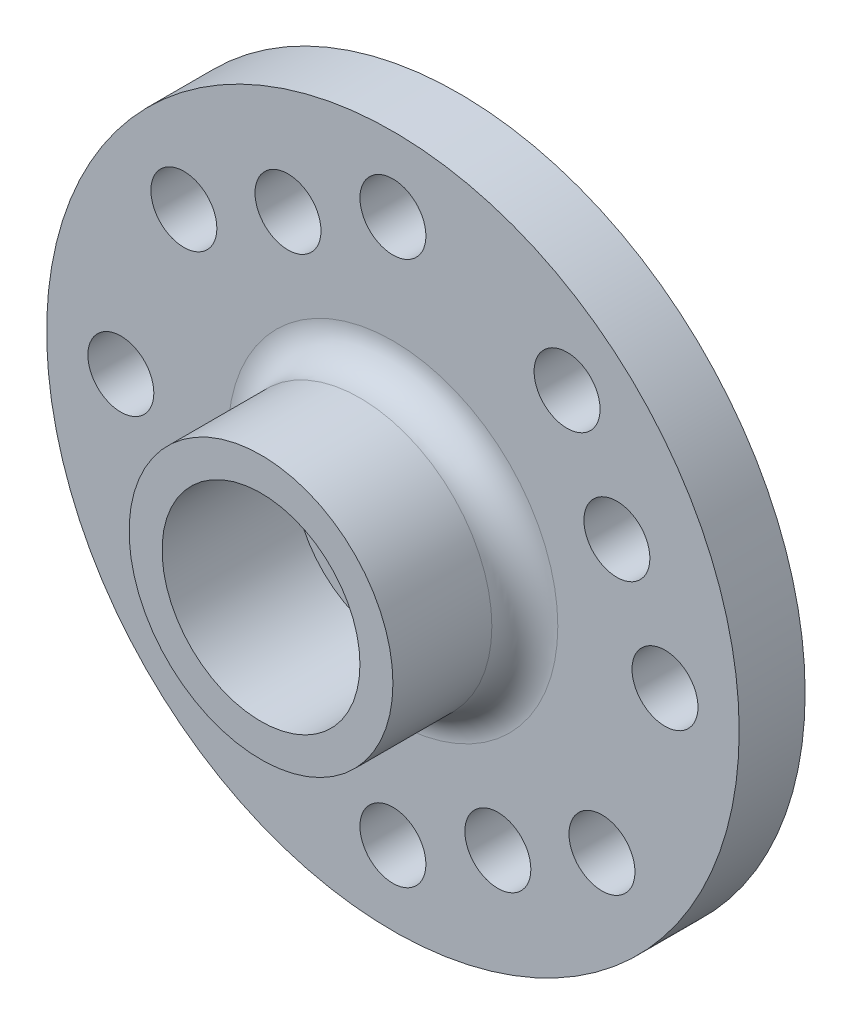
ISO-10303-21;
HEADER;
FILE_DESCRIPTION(('STEP AP214'),'2;1');
FILE_NAME('part.step','',(''),(''),'','','');
FILE_SCHEMA(('AUTOMOTIVE_DESIGN { 1 0 10303 214 1 1 1 1 }'));
ENDSEC;
DATA;
#1=APPLICATION_CONTEXT('core data for automotive mechanical design processes');
#2=APPLICATION_PROTOCOL_DEFINITION('international standard','automotive_design',2000,#1);
#3=PRODUCT_CONTEXT('',#1,'mechanical');
#4=PRODUCT('Part','Part','',(#3));
#5=PRODUCT_RELATED_PRODUCT_CATEGORY('part','',(#4));
#6=PRODUCT_DEFINITION_FORMATION('','',#4);
#7=PRODUCT_DEFINITION_CONTEXT('part definition',#1,'design');
#8=PRODUCT_DEFINITION('design','',#6,#7);
#9=PRODUCT_DEFINITION_SHAPE('','',#8);
#10=(LENGTH_UNIT() NAMED_UNIT(*) SI_UNIT(.MILLI.,.METRE.));
#11=(NAMED_UNIT(*) PLANE_ANGLE_UNIT() SI_UNIT($,.RADIAN.));
#12=(NAMED_UNIT(*) SI_UNIT($,.STERADIAN.) SOLID_ANGLE_UNIT());
#13=UNCERTAINTY_MEASURE_WITH_UNIT(LENGTH_MEASURE(1.E-05),#10,'distance_accuracy_value','');
#14=(GEOMETRIC_REPRESENTATION_CONTEXT(3) GLOBAL_UNCERTAINTY_ASSIGNED_CONTEXT((#13)) GLOBAL_UNIT_ASSIGNED_CONTEXT((#10,
#11,#12)) REPRESENTATION_CONTEXT('',''));
#15=CARTESIAN_POINT('',(0.,0.,0.));
#16=DIRECTION('',(0.,0.,1.));
#17=DIRECTION('',(1.,0.,0.));
#18=AXIS2_PLACEMENT_3D('',#15,#16,#17);
#19=CARTESIAN_POINT('',(0.,0.,0.));
#20=DIRECTION('',(0.,0.,1.));
#21=DIRECTION('',(1.,0.,0.));
#22=AXIS2_PLACEMENT_3D('',#19,#20,#21);
#23=CYLINDRICAL_SURFACE('',#22,1.5);
#24=CARTESIAN_POINT('',(0.,0.,2.));
#25=DIRECTION('',(0.,0.,1.));
#26=DIRECTION('',(1.,0.,0.));
#27=AXIS2_PLACEMENT_3D('',#24,#25,#26);
#28=CIRCLE('',#27,1.5);
#29=CARTESIAN_POINT('',(1.5,0.,2.));
#30=VERTEX_POINT('',#29);
#31=EDGE_CURVE('E133',#30,#30,#28,.T.);
#32=ORIENTED_EDGE('',*,*,#31,.T.);
#33=EDGE_LOOP('',(#32));
#34=FACE_BOUND('',#33,.T.);
#35=CARTESIAN_POINT('',(0.,0.,1.));
#36=DIRECTION('',(0.,0.,-1.));
#37=DIRECTION('',(-1.,0.,0.));
#38=AXIS2_PLACEMENT_3D('',#35,#36,#37);
#39=CIRCLE('',#38,1.5);
#40=CARTESIAN_POINT('',(-1.5,0.,1.));
#41=VERTEX_POINT('',#40);
#42=EDGE_CURVE('E49',#41,#41,#39,.F.);
#43=ORIENTED_EDGE('',*,*,#42,.F.);
#44=EDGE_LOOP('',(#43));
#45=FACE_BOUND('',#44,.T.);
#46=ADVANCED_FACE('F32',(#34,#45),#23,.F.);
#47=CARTESIAN_POINT('',(0.,0.,0.));
#48=DIRECTION('',(0.,0.,1.));
#49=DIRECTION('',(1.,0.,0.));
#50=AXIS2_PLACEMENT_3D('',#47,#48,#49);
#51=PLANE('',#50);
#52=CARTESIAN_POINT('',(3.18181818181818,-6.79161490794724,0.));
#53=DIRECTION('',(0.,0.,-1.));
#54=DIRECTION('',(-1.,0.,0.));
#55=AXIS2_PLACEMENT_3D('',#52,#53,#54);
#56=CIRCLE('',#55,1.);
#57=CARTESIAN_POINT('',(2.18181818181818,-6.79161490794724,0.));
#58=VERTEX_POINT('',#57);
#59=EDGE_CURVE('E106',#58,#58,#56,.T.);
#60=ORIENTED_EDGE('',*,*,#59,.F.);
#61=EDGE_LOOP('',(#60));
#62=FACE_BOUND('',#61,.T.);
#63=CARTESIAN_POINT('',(6.33884058075076,-5.28030303030303,0.));
#64=DIRECTION('',(0.,0.,-1.));
#65=DIRECTION('',(-1.,0.,0.));
#66=AXIS2_PLACEMENT_3D('',#63,#64,#65);
#67=CIRCLE('',#66,0.999999999999999);
#68=CARTESIAN_POINT('',(5.33884058075076,-5.28030303030303,0.));
#69=VERTEX_POINT('',#68);
#70=EDGE_CURVE('E96',#69,#69,#67,.T.);
#71=ORIENTED_EDGE('',*,*,#70,.F.);
#72=EDGE_LOOP('',(#71));
#73=FACE_BOUND('',#72,.T.);
#74=CARTESIAN_POINT('',(6.79161490794724,3.18181818181818,0.));
#75=DIRECTION('',(0.,0.,-1.));
#76=DIRECTION('',(-1.,0.,0.));
#77=AXIS2_PLACEMENT_3D('',#74,#75,#76);
#78=CIRCLE('',#77,0.999999999999999);
#79=CARTESIAN_POINT('',(5.79161490794724,3.18181818181818,0.));
#80=VERTEX_POINT('',#79);
#81=EDGE_CURVE('E93',#80,#80,#78,.T.);
#82=ORIENTED_EDGE('',*,*,#81,.F.);
#83=EDGE_LOOP('',(#82));
#84=FACE_BOUND('',#83,.T.);
#85=CARTESIAN_POINT('',(5.28030303030303,6.33884058075076,0.));
#86=DIRECTION('',(0.,0.,-1.));
#87=DIRECTION('',(-1.,0.,0.));
#88=AXIS2_PLACEMENT_3D('',#85,#86,#87);
#89=CIRCLE('',#88,1.);
#90=CARTESIAN_POINT('',(4.28030303030303,6.33884058075076,0.));
#91=VERTEX_POINT('',#90);
#92=EDGE_CURVE('E90',#91,#91,#89,.T.);
#93=ORIENTED_EDGE('',*,*,#92,.F.);
#94=EDGE_LOOP('',(#93));
#95=FACE_BOUND('',#94,.T.);
#96=CARTESIAN_POINT('',(-3.18181818181818,6.79161490794724,0.));
#97=DIRECTION('',(0.,0.,-1.));
#98=DIRECTION('',(-1.,0.,0.));
#99=AXIS2_PLACEMENT_3D('',#96,#97,#98);
#100=CIRCLE('',#99,1.);
#101=CARTESIAN_POINT('',(-4.18181818181818,6.79161490794724,0.));
#102=VERTEX_POINT('',#101);
#103=EDGE_CURVE('E86',#102,#102,#100,.T.);
#104=ORIENTED_EDGE('',*,*,#103,.F.);
#105=EDGE_LOOP('',(#104));
#106=FACE_BOUND('',#105,.T.);
#107=CARTESIAN_POINT('',(-6.33884058075076,5.28030303030303,0.));
#108=DIRECTION('',(0.,0.,-1.));
#109=DIRECTION('',(-1.,0.,0.));
#110=AXIS2_PLACEMENT_3D('',#107,#108,#109);
#111=CIRCLE('',#110,1.);
#112=CARTESIAN_POINT('',(-7.33884058075076,5.28030303030303,0.));
#113=VERTEX_POINT('',#112);
#114=EDGE_CURVE('E82',#113,#113,#111,.T.);
#115=ORIENTED_EDGE('',*,*,#114,.F.);
#116=EDGE_LOOP('',(#115));
#117=FACE_BOUND('',#116,.T.);
#118=CARTESIAN_POINT('',(-8.25,0.,0.));
#119=DIRECTION('',(0.,0.,-1.));
#120=DIRECTION('',(-1.,0.,0.));
#121=AXIS2_PLACEMENT_3D('',#118,#119,#120);
#122=CIRCLE('',#121,1.);
#123=CARTESIAN_POINT('',(-9.25,0.,0.));
#124=VERTEX_POINT('',#123);
#125=EDGE_CURVE('E78',#124,#124,#122,.T.);
#126=ORIENTED_EDGE('',*,*,#125,.F.);
#127=EDGE_LOOP('',(#126));
#128=FACE_BOUND('',#127,.T.);
#129=CARTESIAN_POINT('',(-6.79161490794724,-3.18181818181818,0.));
#130=DIRECTION('',(0.,0.,-1.));
#131=DIRECTION('',(-1.,0.,0.));
#132=AXIS2_PLACEMENT_3D('',#129,#130,#131);
#133=CIRCLE('',#132,1.);
#134=CARTESIAN_POINT('',(-7.79161490794724,-3.18181818181818,0.));
#135=VERTEX_POINT('',#134);
#136=EDGE_CURVE('E74',#135,#135,#133,.T.);
#137=ORIENTED_EDGE('',*,*,#136,.F.);
#138=EDGE_LOOP('',(#137));
#139=FACE_BOUND('',#138,.T.);
#140=CARTESIAN_POINT('',(-5.28030303030303,-6.33884058075076,0.));
#141=DIRECTION('',(0.,0.,-1.));
#142=DIRECTION('',(-1.,0.,0.));
#143=AXIS2_PLACEMENT_3D('',#140,#141,#142);
#144=CIRCLE('',#143,1.);
#145=CARTESIAN_POINT('',(-6.28030303030303,-6.33884058075076,0.));
#146=VERTEX_POINT('',#145);
#147=EDGE_CURVE('E70',#146,#146,#144,.T.);
#148=ORIENTED_EDGE('',*,*,#147,.F.);
#149=EDGE_LOOP('',(#148));
#150=FACE_BOUND('',#149,.T.);
#151=CARTESIAN_POINT('',(0.,-8.25,0.));
#152=DIRECTION('',(0.,0.,-1.));
#153=DIRECTION('',(-1.,0.,0.));
#154=AXIS2_PLACEMENT_3D('',#151,#152,#153);
#155=CIRCLE('',#154,1.);
#156=CARTESIAN_POINT('',(-1.,-8.25,0.));
#157=VERTEX_POINT('',#156);
#158=EDGE_CURVE('E66',#157,#157,#155,.T.);
#159=ORIENTED_EDGE('',*,*,#158,.F.);
#160=EDGE_LOOP('',(#159));
#161=FACE_BOUND('',#160,.T.);
#162=CARTESIAN_POINT('',(8.25,0.,0.));
#163=DIRECTION('',(0.,0.,-1.));
#164=DIRECTION('',(-1.,0.,0.));
#165=AXIS2_PLACEMENT_3D('',#162,#163,#164);
#166=CIRCLE('',#165,1.);
#167=CARTESIAN_POINT('',(7.25,0.,0.));
#168=VERTEX_POINT('',#167);
#169=EDGE_CURVE('E62',#168,#168,#166,.T.);
#170=ORIENTED_EDGE('',*,*,#169,.F.);
#171=EDGE_LOOP('',(#170));
#172=FACE_BOUND('',#171,.T.);
#173=CARTESIAN_POINT('',(0.,8.25,0.));
#174=DIRECTION('',(0.,0.,-1.));
#175=DIRECTION('',(-1.,0.,0.));
#176=AXIS2_PLACEMENT_3D('',#173,#174,#175);
#177=CIRCLE('',#176,1.);
#178=CARTESIAN_POINT('',(-1.,8.25,0.));
#179=VERTEX_POINT('',#178);
#180=EDGE_CURVE('E58',#179,#179,#177,.T.);
#181=ORIENTED_EDGE('',*,*,#180,.F.);
#182=EDGE_LOOP('',(#181));
#183=FACE_BOUND('',#182,.T.);
#184=CARTESIAN_POINT('',(0.,0.,0.));
#185=DIRECTION('',(0.,0.,1.));
#186=DIRECTION('',(1.,0.,0.));
#187=AXIS2_PLACEMENT_3D('',#184,#185,#186);
#188=CIRCLE('',#187,10.5);
#189=CARTESIAN_POINT('',(10.5,0.,0.));
#190=VERTEX_POINT('',#189);
#191=EDGE_CURVE('E142',#190,#190,#188,.T.);
#192=ORIENTED_EDGE('',*,*,#191,.F.);
#193=EDGE_LOOP('',(#192));
#194=FACE_BOUND('',#193,.T.);
#195=CARTESIAN_POINT('',(0.,0.,0.));
#196=DIRECTION('',(0.,0.,1.));
#197=DIRECTION('',(1.,0.,0.));
#198=AXIS2_PLACEMENT_3D('',#195,#196,#197);
#199=CIRCLE('',#198,3.5);
#200=CARTESIAN_POINT('',(3.5,0.,0.));
#201=VERTEX_POINT('',#200);
#202=EDGE_CURVE('E10',#201,#201,#199,.F.);
#203=ORIENTED_EDGE('',*,*,#202,.F.);
#204=EDGE_LOOP('',(#203));
#205=FACE_BOUND('',#204,.T.);
#206=ADVANCED_FACE('F173',(#62,#73,#84,#95,#106,#117,#128,#139,#150,#161,#172,#183,#194,#205),
#51,.F.);
#207=CARTESIAN_POINT('',(0.,0.,2.));
#208=DIRECTION('',(0.,0.,1.));
#209=DIRECTION('',(1.,0.,0.));
#210=AXIS2_PLACEMENT_3D('',#207,#208,#209);
#211=PLANE('',#210);
#212=CARTESIAN_POINT('',(3.18181818181818,-6.79161490794724,2.));
#213=DIRECTION('',(0.,0.,1.));
#214=DIRECTION('',(1.,0.,0.));
#215=AXIS2_PLACEMENT_3D('',#212,#213,#214);
#216=CIRCLE('',#215,1.);
#217=CARTESIAN_POINT('',(4.18181818181818,-6.79161490794724,2.));
#218=VERTEX_POINT('',#217);
#219=EDGE_CURVE('E36',#218,#218,#216,.T.);
#220=ORIENTED_EDGE('',*,*,#219,.F.);
#221=EDGE_LOOP('',(#220));
#222=FACE_BOUND('',#221,.T.);
#223=CARTESIAN_POINT('',(6.33884058075076,-5.28030303030303,2.));
#224=DIRECTION('',(0.,0.,1.));
#225=DIRECTION('',(1.,0.,0.));
#226=AXIS2_PLACEMENT_3D('',#223,#224,#225);
#227=CIRCLE('',#226,0.999999999999999);
#228=CARTESIAN_POINT('',(7.33884058075076,-5.28030303030303,2.));
#229=VERTEX_POINT('',#228);
#230=EDGE_CURVE('E94',#229,#229,#227,.T.);
#231=ORIENTED_EDGE('',*,*,#230,.F.);
#232=EDGE_LOOP('',(#231));
#233=FACE_BOUND('',#232,.T.);
#234=CARTESIAN_POINT('',(6.79161490794724,3.18181818181818,2.));
#235=DIRECTION('',(0.,0.,1.));
#236=DIRECTION('',(1.,0.,0.));
#237=AXIS2_PLACEMENT_3D('',#234,#235,#236);
#238=CIRCLE('',#237,0.999999999999999);
#239=CARTESIAN_POINT('',(7.79161490794724,3.18181818181818,2.));
#240=VERTEX_POINT('',#239);
#241=EDGE_CURVE('E91',#240,#240,#238,.T.);
#242=ORIENTED_EDGE('',*,*,#241,.F.);
#243=EDGE_LOOP('',(#242));
#244=FACE_BOUND('',#243,.T.);
#245=CARTESIAN_POINT('',(5.28030303030303,6.33884058075076,2.));
#246=DIRECTION('',(0.,0.,1.));
#247=DIRECTION('',(1.,0.,0.));
#248=AXIS2_PLACEMENT_3D('',#245,#246,#247);
#249=CIRCLE('',#248,1.);
#250=CARTESIAN_POINT('',(6.28030303030303,6.33884058075076,2.));
#251=VERTEX_POINT('',#250);
#252=EDGE_CURVE('E87',#251,#251,#249,.T.);
#253=ORIENTED_EDGE('',*,*,#252,.F.);
#254=EDGE_LOOP('',(#253));
#255=FACE_BOUND('',#254,.T.);
#256=CARTESIAN_POINT('',(-3.18181818181818,6.79161490794724,2.));
#257=DIRECTION('',(0.,0.,1.));
#258=DIRECTION('',(1.,0.,0.));
#259=AXIS2_PLACEMENT_3D('',#256,#257,#258);
#260=CIRCLE('',#259,1.);
#261=CARTESIAN_POINT('',(-2.18181818181818,6.79161490794724,2.));
#262=VERTEX_POINT('',#261);
#263=EDGE_CURVE('E83',#262,#262,#260,.T.);
#264=ORIENTED_EDGE('',*,*,#263,.F.);
#265=EDGE_LOOP('',(#264));
#266=FACE_BOUND('',#265,.T.);
#267=CARTESIAN_POINT('',(-6.33884058075076,5.28030303030303,2.));
#268=DIRECTION('',(0.,0.,1.));
#269=DIRECTION('',(1.,0.,0.));
#270=AXIS2_PLACEMENT_3D('',#267,#268,#269);
#271=CIRCLE('',#270,1.);
#272=CARTESIAN_POINT('',(-5.33884058075076,5.28030303030303,2.));
#273=VERTEX_POINT('',#272);
#274=EDGE_CURVE('E79',#273,#273,#271,.T.);
#275=ORIENTED_EDGE('',*,*,#274,.F.);
#276=EDGE_LOOP('',(#275));
#277=FACE_BOUND('',#276,.T.);
#278=CARTESIAN_POINT('',(-8.25,0.,2.));
#279=DIRECTION('',(0.,0.,1.));
#280=DIRECTION('',(1.,0.,0.));
#281=AXIS2_PLACEMENT_3D('',#278,#279,#280);
#282=CIRCLE('',#281,1.);
#283=CARTESIAN_POINT('',(-7.25,0.,2.));
#284=VERTEX_POINT('',#283);
#285=EDGE_CURVE('E75',#284,#284,#282,.T.);
#286=ORIENTED_EDGE('',*,*,#285,.F.);
#287=EDGE_LOOP('',(#286));
#288=FACE_BOUND('',#287,.T.);
#289=CARTESIAN_POINT('',(-6.79161490794724,-3.18181818181818,2.));
#290=DIRECTION('',(0.,0.,1.));
#291=DIRECTION('',(1.,0.,0.));
#292=AXIS2_PLACEMENT_3D('',#289,#290,#291);
#293=CIRCLE('',#292,1.);
#294=CARTESIAN_POINT('',(-5.79161490794724,-3.18181818181818,2.));
#295=VERTEX_POINT('',#294);
#296=EDGE_CURVE('E71',#295,#295,#293,.T.);
#297=ORIENTED_EDGE('',*,*,#296,.F.);
#298=EDGE_LOOP('',(#297));
#299=FACE_BOUND('',#298,.T.);
#300=CARTESIAN_POINT('',(-5.28030303030303,-6.33884058075076,2.));
#301=DIRECTION('',(0.,0.,1.));
#302=DIRECTION('',(1.,0.,0.));
#303=AXIS2_PLACEMENT_3D('',#300,#301,#302);
#304=CIRCLE('',#303,1.);
#305=CARTESIAN_POINT('',(-4.28030303030303,-6.33884058075076,2.));
#306=VERTEX_POINT('',#305);
#307=EDGE_CURVE('E67',#306,#306,#304,.T.);
#308=ORIENTED_EDGE('',*,*,#307,.F.);
#309=EDGE_LOOP('',(#308));
#310=FACE_BOUND('',#309,.T.);
#311=CARTESIAN_POINT('',(0.,-8.25,2.));
#312=DIRECTION('',(0.,0.,1.));
#313=DIRECTION('',(1.,0.,0.));
#314=AXIS2_PLACEMENT_3D('',#311,#312,#313);
#315=CIRCLE('',#314,1.);
#316=CARTESIAN_POINT('',(1.,-8.25,2.));
#317=VERTEX_POINT('',#316);
#318=EDGE_CURVE('E63',#317,#317,#315,.T.);
#319=ORIENTED_EDGE('',*,*,#318,.F.);
#320=EDGE_LOOP('',(#319));
#321=FACE_BOUND('',#320,.T.);
#322=CARTESIAN_POINT('',(8.25,0.,2.));
#323=DIRECTION('',(0.,0.,1.));
#324=DIRECTION('',(1.,0.,0.));
#325=AXIS2_PLACEMENT_3D('',#322,#323,#324);
#326=CIRCLE('',#325,1.);
#327=CARTESIAN_POINT('',(9.25,0.,2.));
#328=VERTEX_POINT('',#327);
#329=EDGE_CURVE('E59',#328,#328,#326,.T.);
#330=ORIENTED_EDGE('',*,*,#329,.F.);
#331=EDGE_LOOP('',(#330));
#332=FACE_BOUND('',#331,.T.);
#333=CARTESIAN_POINT('',(0.,8.25,2.));
#334=DIRECTION('',(0.,0.,1.));
#335=DIRECTION('',(1.,0.,0.));
#336=AXIS2_PLACEMENT_3D('',#333,#334,#335);
#337=CIRCLE('',#336,1.);
#338=CARTESIAN_POINT('',(1.,8.25,2.));
#339=VERTEX_POINT('',#338);
#340=EDGE_CURVE('E54',#339,#339,#337,.T.);
#341=ORIENTED_EDGE('',*,*,#340,.F.);
#342=EDGE_LOOP('',(#341));
#343=FACE_BOUND('',#342,.T.);
#344=CARTESIAN_POINT('',(0.,0.,2.));
#345=DIRECTION('',(0.,0.,1.));
#346=DIRECTION('',(1.,0.,0.));
#347=AXIS2_PLACEMENT_3D('',#344,#345,#346);
#348=CIRCLE('',#347,5.);
#349=CARTESIAN_POINT('',(5.,0.,2.));
#350=VERTEX_POINT('',#349);
#351=EDGE_CURVE('E40',#350,#350,#348,.F.);
#352=ORIENTED_EDGE('',*,*,#351,.T.);
#353=EDGE_LOOP('',(#352));
#354=FACE_BOUND('',#353,.T.);
#355=CARTESIAN_POINT('',(0.,0.,2.));
#356=DIRECTION('',(0.,0.,1.));
#357=DIRECTION('',(1.,0.,0.));
#358=AXIS2_PLACEMENT_3D('',#355,#356,#357);
#359=CIRCLE('',#358,10.5);
#360=CARTESIAN_POINT('',(10.5,0.,2.));
#361=VERTEX_POINT('',#360);
#362=EDGE_CURVE('E143',#361,#361,#359,.T.);
#363=ORIENTED_EDGE('',*,*,#362,.T.);
#364=EDGE_LOOP('',(#363));
#365=FACE_BOUND('',#364,.T.);
#366=ADVANCED_FACE('F170',(#222,#233,#244,#255,#266,#277,#288,#299,#310,#321,#332,#343,#354,
#365),#211,.T.);
#367=CARTESIAN_POINT('',(0.,0.,2.));
#368=DIRECTION('',(0.,0.,-1.));
#369=DIRECTION('',(-1.,0.,0.));
#370=AXIS2_PLACEMENT_3D('',#367,#368,#369);
#371=CYLINDRICAL_SURFACE('',#370,10.5);
#372=ORIENTED_EDGE('',*,*,#362,.F.);
#373=EDGE_LOOP('',(#372));
#374=FACE_BOUND('',#373,.T.);
#375=ORIENTED_EDGE('',*,*,#191,.T.);
#376=EDGE_LOOP('',(#375));
#377=FACE_BOUND('',#376,.T.);
#378=ADVANCED_FACE('F190',(#374,#377),#371,.T.);
#379=CARTESIAN_POINT('',(0.,0.,6.));
#380=DIRECTION('',(0.,0.,1.));
#381=DIRECTION('',(1.,0.,0.));
#382=AXIS2_PLACEMENT_3D('',#379,#380,#381);
#383=PLANE('',#382);
#384=CARTESIAN_POINT('',(0.,0.,6.));
#385=DIRECTION('',(0.,0.,1.));
#386=DIRECTION('',(1.,0.,0.));
#387=AXIS2_PLACEMENT_3D('',#384,#385,#386);
#388=CIRCLE('',#387,4.);
#389=CARTESIAN_POINT('',(4.,0.,6.));
#390=VERTEX_POINT('',#389);
#391=EDGE_CURVE('E139',#390,#390,#388,.T.);
#392=ORIENTED_EDGE('',*,*,#391,.T.);
#393=EDGE_LOOP('',(#392));
#394=FACE_BOUND('',#393,.T.);
#395=CARTESIAN_POINT('',(0.,0.,6.));
#396=DIRECTION('',(0.,0.,1.));
#397=DIRECTION('',(1.,0.,0.));
#398=AXIS2_PLACEMENT_3D('',#395,#396,#397);
#399=CIRCLE('',#398,3.);
#400=CARTESIAN_POINT('',(3.,0.,6.));
#401=VERTEX_POINT('',#400);
#402=EDGE_CURVE('E136',#401,#401,#399,.T.);
#403=ORIENTED_EDGE('',*,*,#402,.F.);
#404=EDGE_LOOP('',(#403));
#405=FACE_BOUND('',#404,.T.);
#406=ADVANCED_FACE('F187',(#394,#405),#383,.T.);
#407=CARTESIAN_POINT('',(0.,0.,6.));
#408=DIRECTION('',(0.,0.,-1.));
#409=DIRECTION('',(-1.,0.,0.));
#410=AXIS2_PLACEMENT_3D('',#407,#408,#409);
#411=CYLINDRICAL_SURFACE('',#410,4.);
#412=CARTESIAN_POINT('',(0.,0.,3.));
#413=DIRECTION('',(0.,0.,1.));
#414=DIRECTION('',(1.,0.,0.));
#415=AXIS2_PLACEMENT_3D('',#412,#413,#414);
#416=CIRCLE('',#415,4.);
#417=CARTESIAN_POINT('',(4.,0.,3.));
#418=VERTEX_POINT('',#417);
#419=EDGE_CURVE('E45',#418,#418,#416,.T.);
#420=ORIENTED_EDGE('',*,*,#419,.T.);
#421=EDGE_LOOP('',(#420));
#422=FACE_BOUND('',#421,.T.);
#423=ORIENTED_EDGE('',*,*,#391,.F.);
#424=EDGE_LOOP('',(#423));
#425=FACE_BOUND('',#424,.T.);
#426=ADVANCED_FACE('F153',(#422,#425),#411,.T.);
#427=CARTESIAN_POINT('',(0.,0.,6.));
#428=DIRECTION('',(0.,0.,-1.));
#429=DIRECTION('',(-1.,0.,0.));
#430=AXIS2_PLACEMENT_3D('',#427,#428,#429);
#431=CYLINDRICAL_SURFACE('',#430,3.);
#432=ORIENTED_EDGE('',*,*,#402,.T.);
#433=EDGE_LOOP('',(#432));
#434=FACE_BOUND('',#433,.T.);
#435=CARTESIAN_POINT('',(0.,0.,2.));
#436=DIRECTION('',(0.,0.,1.));
#437=DIRECTION('',(1.,0.,0.));
#438=AXIS2_PLACEMENT_3D('',#435,#436,#437);
#439=CIRCLE('',#438,3.);
#440=CARTESIAN_POINT('',(3.,0.,2.));
#441=VERTEX_POINT('',#440);
#442=EDGE_CURVE('E146',#441,#441,#439,.F.);
#443=ORIENTED_EDGE('',*,*,#442,.T.);
#444=EDGE_LOOP('',(#443));
#445=FACE_BOUND('',#444,.T.);
#446=ADVANCED_FACE('F167',(#434,#445),#431,.F.);
#447=ORIENTED_EDGE('',*,*,#31,.F.);
#448=EDGE_LOOP('',(#447));
#449=FACE_BOUND('',#448,.T.);
#450=ORIENTED_EDGE('',*,*,#442,.F.);
#451=EDGE_LOOP('',(#450));
#452=FACE_BOUND('',#451,.T.);
#453=ADVANCED_FACE('F158',(#449,#452),#211,.T.);
#454=CARTESIAN_POINT('',(0.,0.,3.));
#455=DIRECTION('',(0.,0.,1.));
#456=DIRECTION('',(1.,0.,0.));
#457=AXIS2_PLACEMENT_3D('',#454,#455,#456);
#458=TOROIDAL_SURFACE('',#457,5.,1.);
#459=ORIENTED_EDGE('',*,*,#351,.F.);
#460=EDGE_LOOP('',(#459));
#461=FACE_BOUND('',#460,.T.);
#462=ORIENTED_EDGE('',*,*,#419,.F.);
#463=EDGE_LOOP('',(#462));
#464=FACE_BOUND('',#463,.T.);
#465=ADVANCED_FACE('F34',(#461,#464),#458,.F.);
#466=CARTESIAN_POINT('',(0.,0.,-0.5));
#467=DIRECTION('',(0.,0.,1.));
#468=DIRECTION('',(1.,0.,0.));
#469=AXIS2_PLACEMENT_3D('',#466,#467,#468);
#470=CYLINDRICAL_SURFACE('',#469,3.5);
#471=CARTESIAN_POINT('',(0.,0.,-0.5));
#472=DIRECTION('',(0.,0.,-1.));
#473=DIRECTION('',(-1.,0.,0.));
#474=AXIS2_PLACEMENT_3D('',#471,#472,#473);
#475=CIRCLE('',#474,3.5);
#476=CARTESIAN_POINT('',(-3.5,0.,-0.5));
#477=VERTEX_POINT('',#476);
#478=EDGE_CURVE('E52',#477,#477,#475,.T.);
#479=ORIENTED_EDGE('',*,*,#478,.F.);
#480=EDGE_LOOP('',(#479));
#481=FACE_BOUND('',#480,.T.);
#482=ORIENTED_EDGE('',*,*,#202,.T.);
#483=EDGE_LOOP('',(#482));
#484=FACE_BOUND('',#483,.T.);
#485=ADVANCED_FACE('F157',(#481,#484),#470,.T.);
#486=CARTESIAN_POINT('',(0.,0.,-0.5));
#487=DIRECTION('',(0.,0.,-1.));
#488=DIRECTION('',(-1.,0.,0.));
#489=AXIS2_PLACEMENT_3D('',#486,#487,#488);
#490=PLANE('',#489);
#491=CARTESIAN_POINT('',(0.,0.,-0.5));
#492=DIRECTION('',(0.,0.,-1.));
#493=DIRECTION('',(-1.,0.,0.));
#494=AXIS2_PLACEMENT_3D('',#491,#492,#493);
#495=CIRCLE('',#494,3.);
#496=CARTESIAN_POINT('',(-3.,0.,-0.5));
#497=VERTEX_POINT('',#496);
#498=EDGE_CURVE('E57',#497,#497,#495,.T.);
#499=ORIENTED_EDGE('',*,*,#498,.F.);
#500=EDGE_LOOP('',(#499));
#501=FACE_BOUND('',#500,.T.);
#502=ORIENTED_EDGE('',*,*,#478,.T.);
#503=EDGE_LOOP('',(#502));
#504=FACE_BOUND('',#503,.T.);
#505=ADVANCED_FACE('F164',(#501,#504),#490,.T.);
#506=CARTESIAN_POINT('',(0.,0.,1.));
#507=DIRECTION('',(0.,0.,-1.));
#508=DIRECTION('',(-1.,0.,0.));
#509=AXIS2_PLACEMENT_3D('',#506,#507,#508);
#510=PLANE('',#509);
#511=CARTESIAN_POINT('',(0.,0.,1.));
#512=DIRECTION('',(0.,0.,-1.));
#513=DIRECTION('',(-1.,0.,0.));
#514=AXIS2_PLACEMENT_3D('',#511,#512,#513);
#515=CIRCLE('',#514,3.);
#516=CARTESIAN_POINT('',(-3.,0.,1.));
#517=VERTEX_POINT('',#516);
#518=EDGE_CURVE('E53',#517,#517,#515,.T.);
#519=ORIENTED_EDGE('',*,*,#518,.T.);
#520=EDGE_LOOP('',(#519));
#521=FACE_BOUND('',#520,.T.);
#522=ORIENTED_EDGE('',*,*,#42,.T.);
#523=EDGE_LOOP('',(#522));
#524=FACE_BOUND('',#523,.T.);
#525=ADVANCED_FACE('F246',(#521,#524),#510,.T.);
#526=CARTESIAN_POINT('',(0.,0.,1.));
#527=DIRECTION('',(0.,0.,-1.));
#528=DIRECTION('',(-1.,0.,0.));
#529=AXIS2_PLACEMENT_3D('',#526,#527,#528);
#530=CYLINDRICAL_SURFACE('',#529,3.);
#531=ORIENTED_EDGE('',*,*,#518,.F.);
#532=EDGE_LOOP('',(#531));
#533=FACE_BOUND('',#532,.T.);
#534=ORIENTED_EDGE('',*,*,#498,.T.);
#535=EDGE_LOOP('',(#534));
#536=FACE_BOUND('',#535,.T.);
#537=ADVANCED_FACE('F235',(#533,#536),#530,.F.);
#538=CARTESIAN_POINT('',(0.,8.25,6.));
#539=DIRECTION('',(0.,0.,-1.));
#540=DIRECTION('',(-1.,0.,0.));
#541=AXIS2_PLACEMENT_3D('',#538,#539,#540);
#542=CYLINDRICAL_SURFACE('',#541,1.);
#543=ORIENTED_EDGE('',*,*,#340,.T.);
#544=EDGE_LOOP('',(#543));
#545=FACE_BOUND('',#544,.T.);
#546=ORIENTED_EDGE('',*,*,#180,.T.);
#547=EDGE_LOOP('',(#546));
#548=FACE_BOUND('',#547,.T.);
#549=ADVANCED_FACE('F231',(#545,#548),#542,.F.);
#550=CARTESIAN_POINT('',(8.25,0.,6.));
#551=DIRECTION('',(0.,0.,-1.));
#552=DIRECTION('',(-1.,0.,0.));
#553=AXIS2_PLACEMENT_3D('',#550,#551,#552);
#554=CYLINDRICAL_SURFACE('',#553,1.);
#555=ORIENTED_EDGE('',*,*,#329,.T.);
#556=EDGE_LOOP('',(#555));
#557=FACE_BOUND('',#556,.T.);
#558=ORIENTED_EDGE('',*,*,#169,.T.);
#559=EDGE_LOOP('',(#558));
#560=FACE_BOUND('',#559,.T.);
#561=ADVANCED_FACE('F234',(#557,#560),#554,.F.);
#562=CARTESIAN_POINT('',(0.,-8.25,6.));
#563=DIRECTION('',(0.,0.,-1.));
#564=DIRECTION('',(-1.,0.,0.));
#565=AXIS2_PLACEMENT_3D('',#562,#563,#564);
#566=CYLINDRICAL_SURFACE('',#565,1.);
#567=ORIENTED_EDGE('',*,*,#318,.T.);
#568=EDGE_LOOP('',(#567));
#569=FACE_BOUND('',#568,.T.);
#570=ORIENTED_EDGE('',*,*,#158,.T.);
#571=EDGE_LOOP('',(#570));
#572=FACE_BOUND('',#571,.T.);
#573=ADVANCED_FACE('F243',(#569,#572),#566,.F.);
#574=CARTESIAN_POINT('',(-5.28030303030303,-6.33884058075076,6.));
#575=DIRECTION('',(0.,0.,-1.));
#576=DIRECTION('',(-1.,0.,0.));
#577=AXIS2_PLACEMENT_3D('',#574,#575,#576);
#578=CYLINDRICAL_SURFACE('',#577,1.);
#579=ORIENTED_EDGE('',*,*,#307,.T.);
#580=EDGE_LOOP('',(#579));
#581=FACE_BOUND('',#580,.T.);
#582=ORIENTED_EDGE('',*,*,#147,.T.);
#583=EDGE_LOOP('',(#582));
#584=FACE_BOUND('',#583,.T.);
#585=ADVANCED_FACE('F304',(#581,#584),#578,.F.);
#586=CARTESIAN_POINT('',(-6.79161490794724,-3.18181818181818,6.));
#587=DIRECTION('',(0.,0.,-1.));
#588=DIRECTION('',(-1.,0.,0.));
#589=AXIS2_PLACEMENT_3D('',#586,#587,#588);
#590=CYLINDRICAL_SURFACE('',#589,1.);
#591=ORIENTED_EDGE('',*,*,#296,.T.);
#592=EDGE_LOOP('',(#591));
#593=FACE_BOUND('',#592,.T.);
#594=ORIENTED_EDGE('',*,*,#136,.T.);
#595=EDGE_LOOP('',(#594));
#596=FACE_BOUND('',#595,.T.);
#597=ADVANCED_FACE('F313',(#593,#596),#590,.F.);
#598=CARTESIAN_POINT('',(-8.25,0.,6.));
#599=DIRECTION('',(0.,0.,-1.));
#600=DIRECTION('',(-1.,0.,0.));
#601=AXIS2_PLACEMENT_3D('',#598,#599,#600);
#602=CYLINDRICAL_SURFACE('',#601,1.);
#603=ORIENTED_EDGE('',*,*,#285,.T.);
#604=EDGE_LOOP('',(#603));
#605=FACE_BOUND('',#604,.T.);
#606=ORIENTED_EDGE('',*,*,#125,.T.);
#607=EDGE_LOOP('',(#606));
#608=FACE_BOUND('',#607,.T.);
#609=ADVANCED_FACE('F323',(#605,#608),#602,.F.);
#610=CARTESIAN_POINT('',(-6.33884058075076,5.28030303030303,6.));
#611=DIRECTION('',(0.,0.,-1.));
#612=DIRECTION('',(-1.,0.,0.));
#613=AXIS2_PLACEMENT_3D('',#610,#611,#612);
#614=CYLINDRICAL_SURFACE('',#613,1.);
#615=ORIENTED_EDGE('',*,*,#274,.T.);
#616=EDGE_LOOP('',(#615));
#617=FACE_BOUND('',#616,.T.);
#618=ORIENTED_EDGE('',*,*,#114,.T.);
#619=EDGE_LOOP('',(#618));
#620=FACE_BOUND('',#619,.T.);
#621=ADVANCED_FACE('F333',(#617,#620),#614,.F.);
#622=CARTESIAN_POINT('',(-3.18181818181818,6.79161490794724,6.));
#623=DIRECTION('',(0.,0.,-1.));
#624=DIRECTION('',(-1.,0.,0.));
#625=AXIS2_PLACEMENT_3D('',#622,#623,#624);
#626=CYLINDRICAL_SURFACE('',#625,1.);
#627=ORIENTED_EDGE('',*,*,#263,.T.);
#628=EDGE_LOOP('',(#627));
#629=FACE_BOUND('',#628,.T.);
#630=ORIENTED_EDGE('',*,*,#103,.T.);
#631=EDGE_LOOP('',(#630));
#632=FACE_BOUND('',#631,.T.);
#633=ADVANCED_FACE('F343',(#629,#632),#626,.F.);
#634=CARTESIAN_POINT('',(5.28030303030303,6.33884058075076,6.));
#635=DIRECTION('',(0.,0.,-1.));
#636=DIRECTION('',(-1.,0.,0.));
#637=AXIS2_PLACEMENT_3D('',#634,#635,#636);
#638=CYLINDRICAL_SURFACE('',#637,1.);
#639=ORIENTED_EDGE('',*,*,#252,.T.);
#640=EDGE_LOOP('',(#639));
#641=FACE_BOUND('',#640,.T.);
#642=ORIENTED_EDGE('',*,*,#92,.T.);
#643=EDGE_LOOP('',(#642));
#644=FACE_BOUND('',#643,.T.);
#645=ADVANCED_FACE('F353',(#641,#644),#638,.F.);
#646=CARTESIAN_POINT('',(6.79161490794724,3.18181818181818,6.));
#647=DIRECTION('',(0.,0.,-1.));
#648=DIRECTION('',(-1.,0.,0.));
#649=AXIS2_PLACEMENT_3D('',#646,#647,#648);
#650=CYLINDRICAL_SURFACE('',#649,0.999999999999999);
#651=ORIENTED_EDGE('',*,*,#241,.T.);
#652=EDGE_LOOP('',(#651));
#653=FACE_BOUND('',#652,.T.);
#654=ORIENTED_EDGE('',*,*,#81,.T.);
#655=EDGE_LOOP('',(#654));
#656=FACE_BOUND('',#655,.T.);
#657=ADVANCED_FACE('F363',(#653,#656),#650,.F.);
#658=CARTESIAN_POINT('',(6.33884058075076,-5.28030303030303,6.));
#659=DIRECTION('',(0.,0.,-1.));
#660=DIRECTION('',(-1.,0.,0.));
#661=AXIS2_PLACEMENT_3D('',#658,#659,#660);
#662=CYLINDRICAL_SURFACE('',#661,0.999999999999999);
#663=ORIENTED_EDGE('',*,*,#230,.T.);
#664=EDGE_LOOP('',(#663));
#665=FACE_BOUND('',#664,.T.);
#666=ORIENTED_EDGE('',*,*,#70,.T.);
#667=EDGE_LOOP('',(#666));
#668=FACE_BOUND('',#667,.T.);
#669=ADVANCED_FACE('F373',(#665,#668),#662,.F.);
#670=CARTESIAN_POINT('',(3.18181818181818,-6.79161490794724,6.));
#671=DIRECTION('',(0.,0.,-1.));
#672=DIRECTION('',(-1.,0.,0.));
#673=AXIS2_PLACEMENT_3D('',#670,#671,#672);
#674=CYLINDRICAL_SURFACE('',#673,1.);
#675=ORIENTED_EDGE('',*,*,#219,.T.);
#676=EDGE_LOOP('',(#675));
#677=FACE_BOUND('',#676,.T.);
#678=ORIENTED_EDGE('',*,*,#59,.T.);
#679=EDGE_LOOP('',(#678));
#680=FACE_BOUND('',#679,.T.);
#681=ADVANCED_FACE('F383',(#677,#680),#674,.F.);
#682=CLOSED_SHELL('',(#46,#206,#366,#378,#406,#426,#446,#453,#465,#485,#505,#525,#537,#549,#561,
#573,#585,#597,#609,#621,#633,#645,#657,#669,#681));
#683=MANIFOLD_SOLID_BREP('B2',#682);
#684=ADVANCED_BREP_SHAPE_REPRESENTATION('',(#18,#683),#14);
#685=SHAPE_DEFINITION_REPRESENTATION(#9,#684);
ENDSEC;
END-ISO-10303-21;
